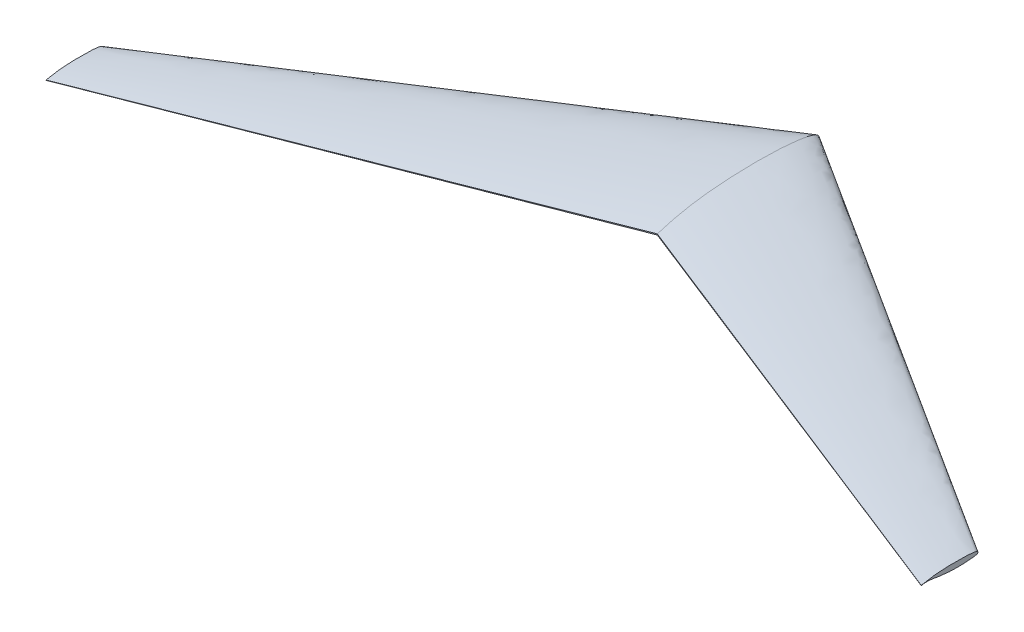
ISO-10303-21;
HEADER;
FILE_DESCRIPTION(('STEP AP214'),'2;1');
FILE_NAME('part.step','',(''),(''),'','','');
FILE_SCHEMA(('AUTOMOTIVE_DESIGN { 1 0 10303 214 1 1 1 1 }'));
ENDSEC;
DATA;
#1=APPLICATION_CONTEXT('core data for automotive mechanical design processes');
#2=APPLICATION_PROTOCOL_DEFINITION('international standard','automotive_design',2000,#1);
#3=PRODUCT_CONTEXT('',#1,'mechanical');
#4=PRODUCT('Part','Part','',(#3));
#5=PRODUCT_RELATED_PRODUCT_CATEGORY('part','',(#4));
#6=PRODUCT_DEFINITION_FORMATION('','',#4);
#7=PRODUCT_DEFINITION_CONTEXT('part definition',#1,'design');
#8=PRODUCT_DEFINITION('design','',#6,#7);
#9=PRODUCT_DEFINITION_SHAPE('','',#8);
#10=(LENGTH_UNIT() NAMED_UNIT(*) SI_UNIT(.MILLI.,.METRE.));
#11=(NAMED_UNIT(*) PLANE_ANGLE_UNIT() SI_UNIT($,.RADIAN.));
#12=(NAMED_UNIT(*) SI_UNIT($,.STERADIAN.) SOLID_ANGLE_UNIT());
#13=UNCERTAINTY_MEASURE_WITH_UNIT(LENGTH_MEASURE(1.E-05),#10,'distance_accuracy_value','');
#14=(GEOMETRIC_REPRESENTATION_CONTEXT(3) GLOBAL_UNCERTAINTY_ASSIGNED_CONTEXT((#13)) GLOBAL_UNIT_ASSIGNED_CONTEXT((#10,
#11,#12)) REPRESENTATION_CONTEXT('',''));
#15=CARTESIAN_POINT('',(0.,0.,0.));
#16=DIRECTION('',(0.,0.,1.));
#17=DIRECTION('',(1.,0.,0.));
#18=AXIS2_PLACEMENT_3D('',#15,#16,#17);
#19=CARTESIAN_POINT('',(-18653.9465965808,-14.5723073233626,14310.6565077803));
#20=DIRECTION('',(-1.,0.,0.));
#21=DIRECTION('',(0.,0.00602622616138375,-0.999981842134272));
#22=AXIS2_PLACEMENT_3D('',#19,#20,#21);
#23=PLANE('',#22);
#24=CARTESIAN_POINT('',(-18653.9465965808,-14.5723073233626,14310.6565077803));
#25=CARTESIAN_POINT('',(-18653.9465965808,38.144055826373,14071.5939287255));
#26=CARTESIAN_POINT('',(-18653.9465965808,74.9530157810596,13828.5523641982));
#27=CARTESIAN_POINT('',(-18653.9465965808,109.027428243963,13426.1931607787));
#28=CARTESIAN_POINT('',(-18653.9465965808,115.768550599674,13264.6162488284));
#29=CARTESIAN_POINT('',(-18653.9465965808,121.920892692821,12946.4645078892));
#30=CARTESIAN_POINT('',(-18653.9465965808,121.543738640045,12782.2251155384));
#31=CARTESIAN_POINT('',(-18653.9465965808,116.811104093113,12466.6958180771));
#32=CARTESIAN_POINT('',(-18653.9465965808,112.276051926359,12301.515072384));
#33=CARTESIAN_POINT('',(-18653.9465965808,87.7504289695687,12116.5311411004));
#34=CARTESIAN_POINT('',(-18653.9465965808,80.6463229636596,12069.7143335256));
#35=CARTESIAN_POINT('',(-18653.9465965808,76.1702758871389,12029.3664495051));
#36=CARTESIAN_POINT('',(-18653.9465965808,58.1611308595273,11962.6431629961));
#37=CARTESIAN_POINT('',(-18653.9465965808,22.8509522508046,11897.9605265008));
#38=CARTESIAN_POINT('',(-18653.9465965808,0.,11892.5523193347));
#39=B_SPLINE_CURVE_WITH_KNOTS('',3,(#24,#25,#26,#27,#28,#29,#30,#31,#32,#33,#34,#35,#36,#37,
#38),.UNSPECIFIED.,.F.,.F.,(4,1,1,1,1,1,1,1,1,1,1,1,4),(0.,0.300306214195935,0.300506353245141,
0.495240719052951,0.498599859365835,0.690406647851814,0.696246131860642,0.886629083789051,
0.894559473605489,0.922025719723024,0.94363650923235,0.948318104073382,1.),.UNSPECIFIED.);
#40=CARTESIAN_POINT('',(-18653.9465965808,0.,11892.5523193347));
#41=VERTEX_POINT('',#40);
#42=CARTESIAN_POINT('',(-18653.9465965808,-14.5723073233626,14310.6565077803));
#43=VERTEX_POINT('',#42);
#44=EDGE_CURVE('E236',#41,#43,#39,.F.);
#45=ORIENTED_EDGE('',*,*,#44,.F.);
#46=CARTESIAN_POINT('',(-18653.9465965808,0.,11892.5523193347));
#47=CARTESIAN_POINT('',(-18653.9465965808,-47.818557129653,11895.2743256167));
#48=CARTESIAN_POINT('',(-18653.9465965808,-58.6909366996812,11957.7533985497));
#49=CARTESIAN_POINT('',(-18653.9465965808,-71.9338131388141,12027.1471251859));
#50=CARTESIAN_POINT('',(-18653.9465965808,-79.9855369928577,12067.8186154246));
#51=CARTESIAN_POINT('',(-18653.9465965808,-85.9867042735809,12114.6829041019));
#52=CARTESIAN_POINT('',(-18653.9465965808,-107.479003983088,12299.6916427934));
#53=CARTESIAN_POINT('',(-18653.9465965808,-114.90227526365,12463.7084740771));
#54=CARTESIAN_POINT('',(-18653.9465965808,-121.491862894208,12781.3463122642));
#55=CARTESIAN_POINT('',(-18653.9465965808,-120.812808888173,12944.6599297862));
#56=CARTESIAN_POINT('',(-18653.9465965808,-102.198469123227,13264.6243985916));
#57=CARTESIAN_POINT('',(-18653.9465965808,-83.7562233687406,13427.1856970672));
#58=CARTESIAN_POINT('',(-18653.9465965808,-44.4281933022232,13666.1087805748));
#59=CARTESIAN_POINT('',(-18653.9465965808,1.09603501319041,13905.5365011696));
#60=CARTESIAN_POINT('',(-18653.9465965808,10.7332760538416,14151.0798138548));
#61=CARTESIAN_POINT('',(-18653.9465965808,-27.0673594356739,14310.6565077803));
#62=B_SPLINE_CURVE_WITH_KNOTS('',3,(#46,#47,#48,#49,#50,#51,#52,#53,#54,#55,#56,#57,#58,#59,#60,
#61),.UNSPECIFIED.,.F.,.F.,(4,1,1,1,1,1,1,1,1,1,1,1,1,4),(0.,0.0546217915879629,
0.0568022946260039,0.0808417609968839,0.108219422965478,0.113833768892824,0.306383441939405,
0.310212468355379,0.503114766214556,0.50559428152025,0.701848021766534,0.702801294739028,
0.801775017183419,1.),.UNSPECIFIED.);
#63=CARTESIAN_POINT('',(-18653.9465965808,-27.0673594356739,14310.6565077803));
#64=VERTEX_POINT('',#63);
#65=EDGE_CURVE('E168',#64,#41,#62,.F.);
#66=ORIENTED_EDGE('',*,*,#65,.F.);
#67=DIRECTION('',(0.,-1.,0.));
#68=VECTOR('',#67,1.);
#69=CARTESIAN_POINT('',(-18653.9465965808,-14.5723073233624,14310.6565077803));
#70=LINE('',#69,#68);
#71=EDGE_CURVE('E136',#43,#64,#70,.T.);
#72=ORIENTED_EDGE('',*,*,#71,.F.);
#73=EDGE_LOOP('',(#45,#66,#72));
#74=FACE_BOUND('',#73,.T.);
#75=ADVANCED_FACE('F133',(#74),#23,.T.);
#76=CARTESIAN_POINT('',(18653.9465965808,-14.5723073233626,14310.6565077803));
#77=DIRECTION('',(1.,0.,0.));
#78=DIRECTION('',(0.,0.00602622616138375,-0.999981842134272));
#79=AXIS2_PLACEMENT_3D('',#76,#77,#78);
#80=PLANE('',#79);
#81=CARTESIAN_POINT('',(18653.9465965808,-14.5723073233626,14310.6565077803));
#82=CARTESIAN_POINT('',(18653.9465965808,38.144055826373,14071.5939287255));
#83=CARTESIAN_POINT('',(18653.9465965808,74.9530157810596,13828.5523641982));
#84=CARTESIAN_POINT('',(18653.9465965808,109.027428243963,13426.1931607787));
#85=CARTESIAN_POINT('',(18653.9465965808,115.768550599674,13264.6162488284));
#86=CARTESIAN_POINT('',(18653.9465965808,121.920892692821,12946.4645078892));
#87=CARTESIAN_POINT('',(18653.9465965808,121.543738640045,12782.2251155384));
#88=CARTESIAN_POINT('',(18653.9465965808,116.811104093113,12466.6958180771));
#89=CARTESIAN_POINT('',(18653.9465965808,112.276051926359,12301.515072384));
#90=CARTESIAN_POINT('',(18653.9465965808,87.7504289695687,12116.5311411004));
#91=CARTESIAN_POINT('',(18653.9465965808,80.6463229636596,12069.7143335256));
#92=CARTESIAN_POINT('',(18653.9465965808,76.1702758871389,12029.3664495051));
#93=CARTESIAN_POINT('',(18653.9465965808,58.1611308595273,11962.6431629961));
#94=CARTESIAN_POINT('',(18653.9465965808,22.8509522508046,11897.9605265008));
#95=CARTESIAN_POINT('',(18653.9465965808,0.,11892.5523193347));
#96=B_SPLINE_CURVE_WITH_KNOTS('',3,(#81,#82,#83,#84,#85,#86,#87,#88,#89,#90,#91,#92,#93,#94,
#95),.UNSPECIFIED.,.F.,.F.,(4,1,1,1,1,1,1,1,1,1,1,1,4),(0.,0.300306214195935,0.300506353245141,
0.495240719052951,0.498599859365835,0.690406647851814,0.696246131860642,0.886629083789051,
0.894559473605489,0.922025719723024,0.94363650923235,0.948318104073382,1.),.UNSPECIFIED.);
#97=CARTESIAN_POINT('',(18653.9465965808,0.,11892.5523193347));
#98=VERTEX_POINT('',#97);
#99=CARTESIAN_POINT('',(18653.9465965808,-14.5723073233626,14310.6565077803));
#100=VERTEX_POINT('',#99);
#101=EDGE_CURVE('E185',#98,#100,#96,.F.);
#102=ORIENTED_EDGE('',*,*,#101,.T.);
#103=DIRECTION('',(0.,-1.,0.));
#104=VECTOR('',#103,1.);
#105=CARTESIAN_POINT('',(18653.9465965808,-14.5723073233624,14310.6565077803));
#106=LINE('',#105,#104);
#107=CARTESIAN_POINT('',(18653.9465965808,-27.0673594356739,14310.6565077803));
#108=VERTEX_POINT('',#107);
#109=EDGE_CURVE('E143',#100,#108,#106,.T.);
#110=ORIENTED_EDGE('',*,*,#109,.T.);
#111=CARTESIAN_POINT('',(18653.9465965808,0.,11892.5523193347));
#112=CARTESIAN_POINT('',(18653.9465965808,-47.818557129653,11895.2743256167));
#113=CARTESIAN_POINT('',(18653.9465965808,-58.6909366996812,11957.7533985497));
#114=CARTESIAN_POINT('',(18653.9465965808,-71.9338131388141,12027.1471251859));
#115=CARTESIAN_POINT('',(18653.9465965808,-79.9855369928577,12067.8186154246));
#116=CARTESIAN_POINT('',(18653.9465965808,-85.9867042735809,12114.6829041019));
#117=CARTESIAN_POINT('',(18653.9465965808,-107.479003983088,12299.6916427934));
#118=CARTESIAN_POINT('',(18653.9465965808,-114.90227526365,12463.7084740771));
#119=CARTESIAN_POINT('',(18653.9465965808,-121.491862894208,12781.3463122642));
#120=CARTESIAN_POINT('',(18653.9465965808,-120.812808888173,12944.6599297862));
#121=CARTESIAN_POINT('',(18653.9465965808,-102.198469123227,13264.6243985916));
#122=CARTESIAN_POINT('',(18653.9465965808,-83.7562233687406,13427.1856970672));
#123=CARTESIAN_POINT('',(18653.9465965808,-44.4281933022232,13666.1087805748));
#124=CARTESIAN_POINT('',(18653.9465965808,1.09603501319041,13905.5365011696));
#125=CARTESIAN_POINT('',(18653.9465965808,10.7332760538416,14151.0798138548));
#126=CARTESIAN_POINT('',(18653.9465965808,-27.0673594356739,14310.6565077803));
#127=B_SPLINE_CURVE_WITH_KNOTS('',3,(#111,#112,#113,#114,#115,#116,#117,#118,#119,#120,#121,
#122,#123,#124,#125,#126),.UNSPECIFIED.,.F.,.F.,(4,1,1,1,1,1,1,1,1,1,1,1,1,4),(0.,
0.0546217915879629,0.0568022946260039,0.0808417609968839,0.108219422965478,0.113833768892824,
0.306383441939405,0.310212468355379,0.503114766214556,0.50559428152025,0.701848021766534,
0.702801294739028,0.801775017183419,1.),.UNSPECIFIED.);
#128=EDGE_CURVE('E181',#108,#98,#127,.F.);
#129=ORIENTED_EDGE('',*,*,#128,.T.);
#130=EDGE_LOOP('',(#102,#110,#129));
#131=FACE_BOUND('',#130,.T.);
#132=ADVANCED_FACE('F183',(#131),#80,.T.);
#133=CARTESIAN_POINT('',(2368.49290069997,0.,5969.06364756718));
#134=DIRECTION('',(0.368820880201053,0.,0.929500488610802));
#135=DIRECTION('',(0.929500488610802,0.,-0.368820880201053));
#136=AXIS2_PLACEMENT_3D('',#133,#134,#135);
#137=PLANE('',#136);
#138=DIRECTION('',(0.929496992390158,-0.00274276876268202,-0.368819492919184));
#139=VECTOR('',#138,1.);
#140=CARTESIAN_POINT('',(-9326.97329829042,-42.0944308184995,10609.7628088125));
#141=LINE('',#140,#139);
#142=CARTESIAN_POINT('',(0.,-69.6165543136363,6908.86910984476));
#143=VERTEX_POINT('',#142);
#144=EDGE_CURVE('E242',#43,#143,#141,.T.);
#145=ORIENTED_EDGE('',*,*,#144,.F.);
#146=ORIENTED_EDGE('',*,*,#71,.T.);
#147=DIRECTION('',(-0.929492062666572,0.00425792975641306,0.368817536830926));
#148=VECTOR('',#147,1.);
#149=CARTESIAN_POINT('',(-9326.97329829042,-69.7934877579842,10609.7628088125));
#150=LINE('',#149,#148);
#151=CARTESIAN_POINT('',(0.,-112.519616080294,6908.86910984476));
#152=VERTEX_POINT('',#151);
#153=EDGE_CURVE('E252',#152,#64,#150,.T.);
#154=ORIENTED_EDGE('',*,*,#153,.F.);
#155=DIRECTION('',(0.,-1.,0.));
#156=VECTOR('',#155,1.);
#157=CARTESIAN_POINT('',(0.,-69.616554313635,6908.86910984476));
#158=LINE('',#157,#156);
#159=EDGE_CURVE('E76',#143,#152,#158,.T.);
#160=ORIENTED_EDGE('',*,*,#159,.F.);
#161=EDGE_LOOP('',(#145,#146,#154,#160));
#162=FACE_BOUND('',#161,.T.);
#163=ADVANCED_FACE('F261',(#162),#137,.T.);
#164=CARTESIAN_POINT('',(0.,0.,0.));
#165=CARTESIAN_POINT('',(-18653.9465965808,0.,11892.5523193347));
#166=CARTESIAN_POINT('',(0.,-177.788302382174,25.8204081020493));
#167=CARTESIAN_POINT('',(-18653.9465965808,-47.818557129653,11895.2743256167));
#168=CARTESIAN_POINT('',(0.,-231.584076299441,158.306517623446));
#169=CARTESIAN_POINT('',(-18653.9465965808,-58.6909366996812,11957.7533985497));
#170=CARTESIAN_POINT('',(0.,-285.78057308525,347.588020285759));
#171=CARTESIAN_POINT('',(-18653.9465965808,-71.9338131388141,12027.1471251859));
#172=CARTESIAN_POINT('',(0.,-316.964643074546,471.401452683257));
#173=CARTESIAN_POINT('',(-18653.9465965808,-79.9855369928577,12067.8186154246));
#174=CARTESIAN_POINT('',(0.,-342.773869478356,601.654102462958));
#175=CARTESIAN_POINT('',(-18653.9465965808,-85.9867042735809,12114.6829041019));
#176=CARTESIAN_POINT('',(0.,-433.456869965633,1118.78416914863));
#177=CARTESIAN_POINT('',(-18653.9465965808,-107.479003983088,12299.6916427934));
#178=CARTESIAN_POINT('',(0.,-461.510959753675,1599.20493496082));
#179=CARTESIAN_POINT('',(-18653.9465965808,-114.90227526365,12463.7084740771));
#180=CARTESIAN_POINT('',(0.,-488.518386541236,2522.33711077729));
#181=CARTESIAN_POINT('',(-18653.9465965808,-121.491862894208,12781.3463122642));
#182=CARTESIAN_POINT('',(0.,-489.226629141485,2992.97481966913));
#183=CARTESIAN_POINT('',(-18653.9465965808,-120.812808888173,12944.6599297862));
#184=CARTESIAN_POINT('',(0.,-401.210962758103,3908.11393954978));
#185=CARTESIAN_POINT('',(-18653.9465965808,-102.198469123227,13264.6243985916));
#186=CARTESIAN_POINT('',(0.,-309.539124318077,4369.43910440885));
#187=CARTESIAN_POINT('',(-18653.9465965808,-83.7562233687406,13427.1856970672));
#188=CARTESIAN_POINT('',(0.,-160.762501103033,5057.83583341267));
#189=CARTESIAN_POINT('',(-18653.9465965808,-44.4281933022232,13666.1087805748));
#190=CARTESIAN_POINT('',(0.,-4.60229806243596,5752.95863091578));
#191=CARTESIAN_POINT('',(-18653.9465965808,1.09603501319041,13905.5365011696));
#192=CARTESIAN_POINT('',(0.,34.3300241800249,6448.03197620827));
#193=CARTESIAN_POINT('',(-18653.9465965808,10.7332760538416,14151.0798138548));
#194=CARTESIAN_POINT('',(0.,-112.519616080294,6908.86910984476));
#195=CARTESIAN_POINT('',(-18653.9465965808,-27.0673594356739,14310.6565077803));
#196=B_SPLINE_SURFACE_WITH_KNOTS('',3,1,((#164,#165),(#166,#167),(#168,#169),(#170,#171),(#172,
#173),(#174,#175),(#176,#177),(#178,#179),(#180,#181),(#182,#183),(#184,#185),(#186,#187),(#188,
#189),(#190,#191),(#192,#193),(#194,#195)),.UNSPECIFIED.,.F.,.F.,.F.,(4,1,1,1,1,1,1,1,1,1,1,1,1,
4),(2,2),(0.,0.0546217915879629,0.0568022946260039,0.0808417609968839,0.108219422965478,
0.113833768892824,0.306383441939405,0.310212468355379,0.503114766214556,0.50559428152025,
0.701848021766534,0.702801294739028,0.801775017183419,1.),(0.,1.),.UNSPECIFIED.);
#197=CARTESIAN_POINT('',(0.,0.,0.));
#198=CARTESIAN_POINT('',(0.,-177.788302382174,25.8204081020493));
#199=CARTESIAN_POINT('',(0.,-231.584076299441,158.306517623446));
#200=CARTESIAN_POINT('',(0.,-285.78057308525,347.588020285759));
#201=CARTESIAN_POINT('',(0.,-316.964643074546,471.401452683257));
#202=CARTESIAN_POINT('',(0.,-342.773869478356,601.654102462958));
#203=CARTESIAN_POINT('',(0.,-433.456869965633,1118.78416914863));
#204=CARTESIAN_POINT('',(0.,-461.510959753675,1599.20493496082));
#205=CARTESIAN_POINT('',(0.,-488.518386541236,2522.33711077729));
#206=CARTESIAN_POINT('',(0.,-489.226629141485,2992.97481966913));
#207=CARTESIAN_POINT('',(0.,-401.210962758103,3908.11393954978));
#208=CARTESIAN_POINT('',(0.,-309.539124318077,4369.43910440885));
#209=CARTESIAN_POINT('',(0.,-160.762501103033,5057.83583341267));
#210=CARTESIAN_POINT('',(0.,-4.60229806243596,5752.95863091578));
#211=CARTESIAN_POINT('',(0.,34.3300241800249,6448.03197620827));
#212=CARTESIAN_POINT('',(0.,-112.519616080294,6908.86910984476));
#213=B_SPLINE_CURVE_WITH_KNOTS('',3,(#197,#198,#199,#200,#201,#202,#203,#204,#205,#206,#207,
#208,#209,#210,#211,#212),.UNSPECIFIED.,.F.,.F.,(4,1,1,1,1,1,1,1,1,1,1,1,1,4),(0.,
0.0546217915879629,0.0568022946260039,0.0808417609968839,0.108219422965478,0.113833768892824,
0.306383441939405,0.310212468355379,0.503114766214556,0.50559428152025,0.701848021766534,
0.702801294739028,0.801775017183419,1.),.UNSPECIFIED.);
#214=CARTESIAN_POINT('',(0.,0.,0.));
#215=VERTEX_POINT('',#214);
#216=EDGE_CURVE('E196',#215,#152,#213,.T.);
#217=DIRECTION('',(-0.843213646617336,0.,0.537578595331226));
#218=VECTOR('',#217,1.);
#219=CARTESIAN_POINT('',(-9326.97329829042,0.,5946.27615966733));
#220=LINE('',#219,#218);
#221=EDGE_CURVE('E241',#215,#41,#220,.T.);
#222=ORIENTED_EDGE('',*,*,#216,.T.);
#223=ORIENTED_EDGE('',*,*,#153,.T.);
#224=ORIENTED_EDGE('',*,*,#65,.T.);
#225=ORIENTED_EDGE('',*,*,#221,.F.);
#226=EDGE_LOOP('',(#222,#223,#224,#225));
#227=FACE_BOUND('',#226,.T.);
#228=ADVANCED_FACE('F313',(#227),#196,.T.);
#229=CARTESIAN_POINT('',(0.,-69.6165543136363,6908.86910984476));
#230=CARTESIAN_POINT('',(-18653.9465965808,-14.5723073233626,14310.6565077803));
#231=CARTESIAN_POINT('',(0.,150.608539689884,6234.52954953888));
#232=CARTESIAN_POINT('',(-18653.9465965808,38.144055826373,14071.5939287255));
#233=CARTESIAN_POINT('',(0.,286.39973404128,5535.78358652097));
#234=CARTESIAN_POINT('',(-18653.9465965808,74.9530157810596,13828.5523641982));
#235=CARTESIAN_POINT('',(0.,420.848240321308,4373.43199206057));
#236=CARTESIAN_POINT('',(-18653.9465965808,109.027428243963,13426.1931607787));
#237=CARTESIAN_POINT('',(0.,451.48580130868,3905.22703181174));
#238=CARTESIAN_POINT('',(-18653.9465965808,115.768550599674,13264.6162488284));
#239=CARTESIAN_POINT('',(0.,484.569937660727,2988.60055441247));
#240=CARTESIAN_POINT('',(-18653.9465965808,121.920892692821,12946.4645078892));
#241=CARTESIAN_POINT('',(0.,487.750198346482,2517.89105092005));
#242=CARTESIAN_POINT('',(-18653.9465965808,121.543738640045,12782.2251155384));
#243=CARTESIAN_POINT('',(0.,457.625572203823,1591.65083860145));
#244=CARTESIAN_POINT('',(-18653.9465965808,116.811104093113,12466.6958180771));
#245=CARTESIAN_POINT('',(0.,422.22666196345,1096.6133956986));
#246=CARTESIAN_POINT('',(-18653.9465965808,112.276051926359,12301.515072384));
#247=CARTESIAN_POINT('',(0.,339.088720188347,593.594061648109));
#248=CARTESIAN_POINT('',(-18653.9465965808,87.7504289695687,12116.5311411004));
#249=CARTESIAN_POINT('',(0.,314.667664846961,466.767639908247));
#250=CARTESIAN_POINT('',(-18653.9465965808,80.6463229636596,12069.7143335256));
#251=CARTESIAN_POINT('',(0.,280.602024501721,339.156009998362));
#252=CARTESIAN_POINT('',(-18653.9465965808,76.1702758871389,12029.3664495051));
#253=CARTESIAN_POINT('',(0.,218.609426433931,142.790683507065));
#254=CARTESIAN_POINT('',(-18653.9465965808,58.1611308595273,11962.6431629961));
#255=CARTESIAN_POINT('',(0.,147.744350315997,-1.87596635575002));
#256=CARTESIAN_POINT('',(-18653.9465965808,22.8509522508046,11897.9605265008));
#257=CARTESIAN_POINT('',(0.,0.,0.));
#258=CARTESIAN_POINT('',(-18653.9465965808,0.,11892.5523193347));
#259=B_SPLINE_SURFACE_WITH_KNOTS('',3,1,((#229,#230),(#231,#232),(#233,#234),(#235,#236),(#237,
#238),(#239,#240),(#241,#242),(#243,#244),(#245,#246),(#247,#248),(#249,#250),(#251,#252),(#253,
#254),(#255,#256),(#257,#258)),.UNSPECIFIED.,.F.,.F.,.F.,(4,1,1,1,1,1,1,1,1,1,1,1,4),(2,2),(0.,
0.300306214195935,0.300506353245141,0.495240719052951,0.498599859365835,0.690406647851814,
0.696246131860642,0.886629083789051,0.894559473605489,0.922025719723024,0.94363650923235,
0.948318104073382,1.),(0.,1.),.UNSPECIFIED.);
#260=CARTESIAN_POINT('',(0.,-69.6165543136363,6908.86910984476));
#261=CARTESIAN_POINT('',(0.,150.608539689884,6234.52954953888));
#262=CARTESIAN_POINT('',(0.,286.39973404128,5535.78358652097));
#263=CARTESIAN_POINT('',(0.,420.848240321308,4373.43199206057));
#264=CARTESIAN_POINT('',(0.,451.48580130868,3905.22703181174));
#265=CARTESIAN_POINT('',(0.,484.569937660727,2988.60055441247));
#266=CARTESIAN_POINT('',(0.,487.750198346482,2517.89105092005));
#267=CARTESIAN_POINT('',(0.,457.625572203823,1591.65083860145));
#268=CARTESIAN_POINT('',(0.,422.22666196345,1096.6133956986));
#269=CARTESIAN_POINT('',(0.,339.088720188347,593.594061648109));
#270=CARTESIAN_POINT('',(0.,314.667664846961,466.767639908247));
#271=CARTESIAN_POINT('',(0.,280.602024501721,339.156009998362));
#272=CARTESIAN_POINT('',(0.,218.609426433931,142.790683507065));
#273=CARTESIAN_POINT('',(0.,147.744350315997,-1.87596635575002));
#274=CARTESIAN_POINT('',(0.,0.,0.));
#275=B_SPLINE_CURVE_WITH_KNOTS('',3,(#260,#261,#262,#263,#264,#265,#266,#267,#268,#269,#270,
#271,#272,#273,#274),.UNSPECIFIED.,.F.,.F.,(4,1,1,1,1,1,1,1,1,1,1,1,4),(0.,0.300306214195935,
0.300506353245141,0.495240719052951,0.498599859365835,0.690406647851814,0.696246131860642,
0.886629083789051,0.894559473605489,0.922025719723024,0.94363650923235,0.948318104073382,1.),.UNSPECIFIED.);
#276=EDGE_CURVE('E190',#143,#215,#275,.T.);
#277=ORIENTED_EDGE('',*,*,#276,.T.);
#278=ORIENTED_EDGE('',*,*,#221,.T.);
#279=ORIENTED_EDGE('',*,*,#44,.T.);
#280=ORIENTED_EDGE('',*,*,#144,.T.);
#281=EDGE_LOOP('',(#277,#278,#279,#280));
#282=FACE_BOUND('',#281,.T.);
#283=ADVANCED_FACE('F263',(#282),#259,.T.);
#284=CARTESIAN_POINT('',(-2368.49290069997,0.,5969.06364756718));
#285=DIRECTION('',(-0.368820880201053,0.,0.929500488610802));
#286=DIRECTION('',(-0.929500488610802,0.,-0.368820880201053));
#287=AXIS2_PLACEMENT_3D('',#284,#285,#286);
#288=PLANE('',#287);
#289=DIRECTION('',(-0.929496992390158,-0.00274276876268202,-0.368819492919184));
#290=VECTOR('',#289,1.);
#291=CARTESIAN_POINT('',(9326.97329829042,-42.0944308184995,10609.7628088125));
#292=LINE('',#291,#290);
#293=EDGE_CURVE('E203',#100,#143,#292,.T.);
#294=ORIENTED_EDGE('',*,*,#293,.T.);
#295=ORIENTED_EDGE('',*,*,#159,.T.);
#296=DIRECTION('',(0.929492062666572,0.00425792975641306,0.368817536830926));
#297=VECTOR('',#296,1.);
#298=CARTESIAN_POINT('',(9326.97329829042,-69.7934877579842,10609.7628088125));
#299=LINE('',#298,#297);
#300=EDGE_CURVE('E189',#152,#108,#299,.T.);
#301=ORIENTED_EDGE('',*,*,#300,.T.);
#302=ORIENTED_EDGE('',*,*,#109,.F.);
#303=EDGE_LOOP('',(#294,#295,#301,#302));
#304=FACE_BOUND('',#303,.T.);
#305=ADVANCED_FACE('F266',(#304),#288,.T.);
#306=CARTESIAN_POINT('',(0.,0.,0.));
#307=CARTESIAN_POINT('',(18653.9465965808,0.,11892.5523193347));
#308=CARTESIAN_POINT('',(0.,-177.788302382174,25.8204081020493));
#309=CARTESIAN_POINT('',(18653.9465965808,-47.818557129653,11895.2743256167));
#310=CARTESIAN_POINT('',(0.,-231.584076299441,158.306517623446));
#311=CARTESIAN_POINT('',(18653.9465965808,-58.6909366996812,11957.7533985497));
#312=CARTESIAN_POINT('',(0.,-285.78057308525,347.588020285759));
#313=CARTESIAN_POINT('',(18653.9465965808,-71.9338131388141,12027.1471251859));
#314=CARTESIAN_POINT('',(0.,-316.964643074546,471.401452683257));
#315=CARTESIAN_POINT('',(18653.9465965808,-79.9855369928577,12067.8186154246));
#316=CARTESIAN_POINT('',(0.,-342.773869478356,601.654102462958));
#317=CARTESIAN_POINT('',(18653.9465965808,-85.9867042735809,12114.6829041019));
#318=CARTESIAN_POINT('',(0.,-433.456869965633,1118.78416914863));
#319=CARTESIAN_POINT('',(18653.9465965808,-107.479003983088,12299.6916427934));
#320=CARTESIAN_POINT('',(0.,-461.510959753675,1599.20493496082));
#321=CARTESIAN_POINT('',(18653.9465965808,-114.90227526365,12463.7084740771));
#322=CARTESIAN_POINT('',(0.,-488.518386541236,2522.33711077729));
#323=CARTESIAN_POINT('',(18653.9465965808,-121.491862894208,12781.3463122642));
#324=CARTESIAN_POINT('',(0.,-489.226629141485,2992.97481966913));
#325=CARTESIAN_POINT('',(18653.9465965808,-120.812808888173,12944.6599297862));
#326=CARTESIAN_POINT('',(0.,-401.210962758103,3908.11393954978));
#327=CARTESIAN_POINT('',(18653.9465965808,-102.198469123227,13264.6243985916));
#328=CARTESIAN_POINT('',(0.,-309.539124318077,4369.43910440885));
#329=CARTESIAN_POINT('',(18653.9465965808,-83.7562233687406,13427.1856970672));
#330=CARTESIAN_POINT('',(0.,-160.762501103033,5057.83583341267));
#331=CARTESIAN_POINT('',(18653.9465965808,-44.4281933022232,13666.1087805748));
#332=CARTESIAN_POINT('',(0.,-4.60229806243596,5752.95863091578));
#333=CARTESIAN_POINT('',(18653.9465965808,1.09603501319041,13905.5365011696));
#334=CARTESIAN_POINT('',(0.,34.3300241800249,6448.03197620827));
#335=CARTESIAN_POINT('',(18653.9465965808,10.7332760538416,14151.0798138548));
#336=CARTESIAN_POINT('',(0.,-112.519616080294,6908.86910984476));
#337=CARTESIAN_POINT('',(18653.9465965808,-27.0673594356739,14310.6565077803));
#338=B_SPLINE_SURFACE_WITH_KNOTS('',3,1,((#306,#307),(#308,#309),(#310,#311),(#312,#313),(#314,
#315),(#316,#317),(#318,#319),(#320,#321),(#322,#323),(#324,#325),(#326,#327),(#328,#329),(#330,
#331),(#332,#333),(#334,#335),(#336,#337)),.UNSPECIFIED.,.F.,.F.,.F.,(4,1,1,1,1,1,1,1,1,1,1,1,1,
4),(2,2),(0.,0.0546217915879629,0.0568022946260039,0.0808417609968839,0.108219422965478,
0.113833768892824,0.306383441939405,0.310212468355379,0.503114766214556,0.50559428152025,
0.701848021766534,0.702801294739028,0.801775017183419,1.),(0.,1.),.UNSPECIFIED.);
#339=DIRECTION('',(0.843213646617336,0.,0.537578595331226));
#340=VECTOR('',#339,1.);
#341=CARTESIAN_POINT('',(9326.97329829042,0.,5946.27615966733));
#342=LINE('',#341,#340);
#343=EDGE_CURVE('E194',#215,#98,#342,.T.);
#344=ORIENTED_EDGE('',*,*,#216,.F.);
#345=ORIENTED_EDGE('',*,*,#343,.T.);
#346=ORIENTED_EDGE('',*,*,#128,.F.);
#347=ORIENTED_EDGE('',*,*,#300,.F.);
#348=EDGE_LOOP('',(#344,#345,#346,#347));
#349=FACE_BOUND('',#348,.T.);
#350=ADVANCED_FACE('F195',(#349),#338,.F.);
#351=CARTESIAN_POINT('',(0.,-69.6165543136363,6908.86910984476));
#352=CARTESIAN_POINT('',(18653.9465965808,-14.5723073233626,14310.6565077803));
#353=CARTESIAN_POINT('',(0.,150.608539689884,6234.52954953888));
#354=CARTESIAN_POINT('',(18653.9465965808,38.144055826373,14071.5939287255));
#355=CARTESIAN_POINT('',(0.,286.39973404128,5535.78358652097));
#356=CARTESIAN_POINT('',(18653.9465965808,74.9530157810596,13828.5523641982));
#357=CARTESIAN_POINT('',(0.,420.848240321308,4373.43199206057));
#358=CARTESIAN_POINT('',(18653.9465965808,109.027428243963,13426.1931607787));
#359=CARTESIAN_POINT('',(0.,451.48580130868,3905.22703181174));
#360=CARTESIAN_POINT('',(18653.9465965808,115.768550599674,13264.6162488284));
#361=CARTESIAN_POINT('',(0.,484.569937660727,2988.60055441247));
#362=CARTESIAN_POINT('',(18653.9465965808,121.920892692821,12946.4645078892));
#363=CARTESIAN_POINT('',(0.,487.750198346482,2517.89105092005));
#364=CARTESIAN_POINT('',(18653.9465965808,121.543738640045,12782.2251155384));
#365=CARTESIAN_POINT('',(0.,457.625572203823,1591.65083860145));
#366=CARTESIAN_POINT('',(18653.9465965808,116.811104093113,12466.6958180771));
#367=CARTESIAN_POINT('',(0.,422.22666196345,1096.6133956986));
#368=CARTESIAN_POINT('',(18653.9465965808,112.276051926359,12301.515072384));
#369=CARTESIAN_POINT('',(0.,339.088720188347,593.594061648109));
#370=CARTESIAN_POINT('',(18653.9465965808,87.7504289695687,12116.5311411004));
#371=CARTESIAN_POINT('',(0.,314.667664846961,466.767639908247));
#372=CARTESIAN_POINT('',(18653.9465965808,80.6463229636596,12069.7143335256));
#373=CARTESIAN_POINT('',(0.,280.602024501721,339.156009998362));
#374=CARTESIAN_POINT('',(18653.9465965808,76.1702758871389,12029.3664495051));
#375=CARTESIAN_POINT('',(0.,218.609426433931,142.790683507065));
#376=CARTESIAN_POINT('',(18653.9465965808,58.1611308595273,11962.6431629961));
#377=CARTESIAN_POINT('',(0.,147.744350315997,-1.87596635575002));
#378=CARTESIAN_POINT('',(18653.9465965808,22.8509522508046,11897.9605265008));
#379=CARTESIAN_POINT('',(0.,0.,0.));
#380=CARTESIAN_POINT('',(18653.9465965808,0.,11892.5523193347));
#381=B_SPLINE_SURFACE_WITH_KNOTS('',3,1,((#351,#352),(#353,#354),(#355,#356),(#357,#358),(#359,
#360),(#361,#362),(#363,#364),(#365,#366),(#367,#368),(#369,#370),(#371,#372),(#373,#374),(#375,
#376),(#377,#378),(#379,#380)),.UNSPECIFIED.,.F.,.F.,.F.,(4,1,1,1,1,1,1,1,1,1,1,1,4),(2,2),(0.,
0.300306214195935,0.300506353245141,0.495240719052951,0.498599859365835,0.690406647851814,
0.696246131860642,0.886629083789051,0.894559473605489,0.922025719723024,0.94363650923235,
0.948318104073382,1.),(0.,1.),.UNSPECIFIED.);
#382=ORIENTED_EDGE('',*,*,#276,.F.);
#383=ORIENTED_EDGE('',*,*,#293,.F.);
#384=ORIENTED_EDGE('',*,*,#101,.F.);
#385=ORIENTED_EDGE('',*,*,#343,.F.);
#386=EDGE_LOOP('',(#382,#383,#384,#385));
#387=FACE_BOUND('',#386,.T.);
#388=ADVANCED_FACE('F201',(#387),#381,.F.);
#389=CLOSED_SHELL('',(#75,#132,#163,#228,#283,#305,#350,#388));
#390=MANIFOLD_SOLID_BREP('B7',#389);
#391=ADVANCED_BREP_SHAPE_REPRESENTATION('',(#18,#390),#14);
#392=SHAPE_DEFINITION_REPRESENTATION(#9,#391);
ENDSEC;
END-ISO-10303-21;
